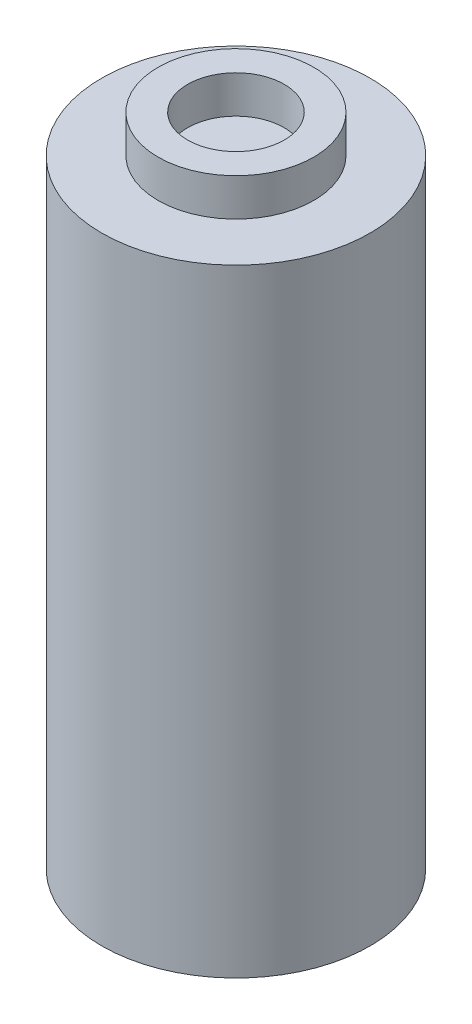
ISO-10303-21;
HEADER;
FILE_DESCRIPTION(('STEP AP214'),'2;1');
FILE_NAME('part.step','',(''),(''),'','','');
FILE_SCHEMA(('AUTOMOTIVE_DESIGN { 1 0 10303 214 1 1 1 1 }'));
ENDSEC;
DATA;
#1=APPLICATION_CONTEXT('core data for automotive mechanical design processes');
#2=APPLICATION_PROTOCOL_DEFINITION('international standard','automotive_design',2000,#1);
#3=PRODUCT_CONTEXT('',#1,'mechanical');
#4=PRODUCT('Part','Part','',(#3));
#5=PRODUCT_RELATED_PRODUCT_CATEGORY('part','',(#4));
#6=PRODUCT_DEFINITION_FORMATION('','',#4);
#7=PRODUCT_DEFINITION_CONTEXT('part definition',#1,'design');
#8=PRODUCT_DEFINITION('design','',#6,#7);
#9=PRODUCT_DEFINITION_SHAPE('','',#8);
#10=(LENGTH_UNIT() NAMED_UNIT(*) SI_UNIT(.MILLI.,.METRE.));
#11=(NAMED_UNIT(*) PLANE_ANGLE_UNIT() SI_UNIT($,.RADIAN.));
#12=(NAMED_UNIT(*) SI_UNIT($,.STERADIAN.) SOLID_ANGLE_UNIT());
#13=UNCERTAINTY_MEASURE_WITH_UNIT(LENGTH_MEASURE(1.E-05),#10,'distance_accuracy_value','');
#14=(GEOMETRIC_REPRESENTATION_CONTEXT(3) GLOBAL_UNCERTAINTY_ASSIGNED_CONTEXT((#13)) GLOBAL_UNIT_ASSIGNED_CONTEXT((#10,
#11,#12)) REPRESENTATION_CONTEXT('',''));
#15=CARTESIAN_POINT('',(0.,0.,0.));
#16=DIRECTION('',(0.,0.,1.));
#17=DIRECTION('',(1.,0.,0.));
#18=AXIS2_PLACEMENT_3D('',#15,#16,#17);
#19=CARTESIAN_POINT('',(0.,23.,0.));
#20=DIRECTION('',(0.,-1.,0.));
#21=DIRECTION('',(0.,0.,-1.));
#22=AXIS2_PLACEMENT_3D('',#19,#20,#21);
#23=CYLINDRICAL_SURFACE('',#22,5.);
#24=CARTESIAN_POINT('',(0.,23.,0.));
#25=DIRECTION('',(0.,1.,0.));
#26=DIRECTION('',(0.,0.,1.));
#27=AXIS2_PLACEMENT_3D('',#24,#25,#26);
#28=CIRCLE('',#27,5.);
#29=CARTESIAN_POINT('',(0.,23.,5.));
#30=VERTEX_POINT('',#29);
#31=EDGE_CURVE('E43',#30,#30,#28,.T.);
#32=ORIENTED_EDGE('',*,*,#31,.F.);
#33=EDGE_LOOP('',(#32));
#34=FACE_BOUND('',#33,.T.);
#35=CARTESIAN_POINT('',(0.,0.,0.));
#36=DIRECTION('',(0.,1.,0.));
#37=DIRECTION('',(0.,0.,1.));
#38=AXIS2_PLACEMENT_3D('',#35,#36,#37);
#39=CIRCLE('',#38,5.);
#40=CARTESIAN_POINT('',(0.,0.,5.));
#41=VERTEX_POINT('',#40);
#42=EDGE_CURVE('E47',#41,#41,#39,.T.);
#43=ORIENTED_EDGE('',*,*,#42,.T.);
#44=EDGE_LOOP('',(#43));
#45=FACE_BOUND('',#44,.T.);
#46=ADVANCED_FACE('F37',(#34,#45),#23,.T.);
#47=CARTESIAN_POINT('',(0.,23.,0.));
#48=DIRECTION('',(0.,1.,0.));
#49=DIRECTION('',(0.,0.,1.));
#50=AXIS2_PLACEMENT_3D('',#47,#48,#49);
#51=PLANE('',#50);
#52=CARTESIAN_POINT('',(0.,23.,0.));
#53=DIRECTION('',(0.,1.,0.));
#54=DIRECTION('',(0.,0.,1.));
#55=AXIS2_PLACEMENT_3D('',#52,#53,#54);
#56=CIRCLE('',#55,2.9);
#57=CARTESIAN_POINT('',(0.,23.,2.9));
#58=VERTEX_POINT('',#57);
#59=EDGE_CURVE('E54',#58,#58,#56,.T.);
#60=ORIENTED_EDGE('',*,*,#59,.F.);
#61=EDGE_LOOP('',(#60));
#62=FACE_BOUND('',#61,.T.);
#63=ORIENTED_EDGE('',*,*,#31,.T.);
#64=EDGE_LOOP('',(#63));
#65=FACE_BOUND('',#64,.T.);
#66=ADVANCED_FACE('F77',(#62,#65),#51,.T.);
#67=CARTESIAN_POINT('',(0.,0.,0.));
#68=DIRECTION('',(0.,1.,0.));
#69=DIRECTION('',(0.,0.,1.));
#70=AXIS2_PLACEMENT_3D('',#67,#68,#69);
#71=PLANE('',#70);
#72=ORIENTED_EDGE('',*,*,#42,.F.);
#73=EDGE_LOOP('',(#72));
#74=FACE_BOUND('',#73,.T.);
#75=ADVANCED_FACE('F68',(#74),#71,.F.);
#76=CARTESIAN_POINT('',(0.,24.4,0.));
#77=DIRECTION('',(0.,1.,0.));
#78=DIRECTION('',(0.,0.,1.));
#79=AXIS2_PLACEMENT_3D('',#76,#77,#78);
#80=PLANE('',#79);
#81=CARTESIAN_POINT('',(0.,24.4,0.));
#82=DIRECTION('',(0.,1.,0.));
#83=DIRECTION('',(0.,0.,1.));
#84=AXIS2_PLACEMENT_3D('',#81,#82,#83);
#85=CIRCLE('',#84,2.9);
#86=CARTESIAN_POINT('',(0.,24.4,2.9));
#87=VERTEX_POINT('',#86);
#88=EDGE_CURVE('E52',#87,#87,#85,.T.);
#89=ORIENTED_EDGE('',*,*,#88,.T.);
#90=EDGE_LOOP('',(#89));
#91=FACE_BOUND('',#90,.T.);
#92=CARTESIAN_POINT('',(0.,24.4,0.));
#93=DIRECTION('',(0.,1.,0.));
#94=DIRECTION('',(0.,0.,1.));
#95=AXIS2_PLACEMENT_3D('',#92,#93,#94);
#96=CIRCLE('',#95,1.8);
#97=CARTESIAN_POINT('',(0.,24.4,1.8));
#98=VERTEX_POINT('',#97);
#99=EDGE_CURVE('E57',#98,#98,#96,.T.);
#100=ORIENTED_EDGE('',*,*,#99,.F.);
#101=EDGE_LOOP('',(#100));
#102=FACE_BOUND('',#101,.T.);
#103=ADVANCED_FACE('F65',(#91,#102),#80,.T.);
#104=CARTESIAN_POINT('',(0.,24.4,0.));
#105=DIRECTION('',(0.,-1.,0.));
#106=DIRECTION('',(0.,0.,-1.));
#107=AXIS2_PLACEMENT_3D('',#104,#105,#106);
#108=CYLINDRICAL_SURFACE('',#107,2.9);
#109=ORIENTED_EDGE('',*,*,#88,.F.);
#110=EDGE_LOOP('',(#109));
#111=FACE_BOUND('',#110,.T.);
#112=ORIENTED_EDGE('',*,*,#59,.T.);
#113=EDGE_LOOP('',(#112));
#114=FACE_BOUND('',#113,.T.);
#115=ADVANCED_FACE('F67',(#111,#114),#108,.T.);
#116=CARTESIAN_POINT('',(0.,24.4,0.));
#117=DIRECTION('',(0.,-1.,0.));
#118=DIRECTION('',(0.,0.,-1.));
#119=AXIS2_PLACEMENT_3D('',#116,#117,#118);
#120=CYLINDRICAL_SURFACE('',#119,1.8);
#121=ORIENTED_EDGE('',*,*,#99,.T.);
#122=EDGE_LOOP('',(#121));
#123=FACE_BOUND('',#122,.T.);
#124=CARTESIAN_POINT('',(0.,23.,0.));
#125=DIRECTION('',(0.,1.,0.));
#126=DIRECTION('',(0.,0.,1.));
#127=AXIS2_PLACEMENT_3D('',#124,#125,#126);
#128=CIRCLE('',#127,1.8);
#129=CARTESIAN_POINT('',(0.,23.,1.8));
#130=VERTEX_POINT('',#129);
#131=EDGE_CURVE('E10',#130,#130,#128,.F.);
#132=ORIENTED_EDGE('',*,*,#131,.T.);
#133=EDGE_LOOP('',(#132));
#134=FACE_BOUND('',#133,.T.);
#135=ADVANCED_FACE('F63',(#123,#134),#120,.F.);
#136=ORIENTED_EDGE('',*,*,#131,.F.);
#137=EDGE_LOOP('',(#136));
#138=FACE_BOUND('',#137,.T.);
#139=ADVANCED_FACE('F87',(#138),#51,.T.);
#140=CLOSED_SHELL('',(#46,#66,#75,#103,#115,#135,#139));
#141=MANIFOLD_SOLID_BREP('B2',#140);
#142=ADVANCED_BREP_SHAPE_REPRESENTATION('',(#18,#141),#14);
#143=SHAPE_DEFINITION_REPRESENTATION(#9,#142);
ENDSEC;
END-ISO-10303-21;
